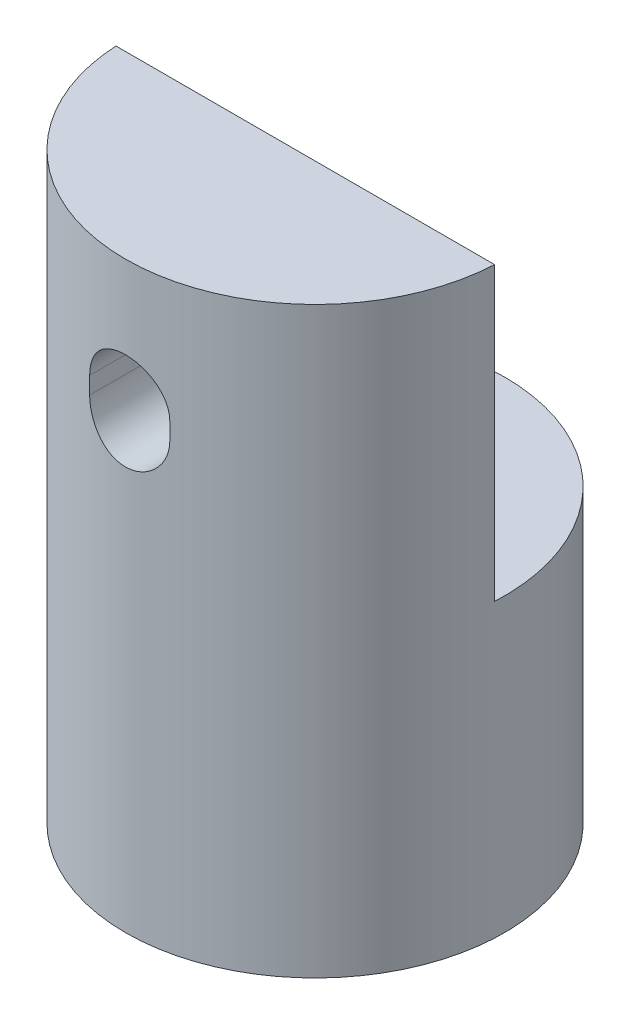
ISO-10303-21;
HEADER;
FILE_DESCRIPTION(('STEP AP214'),'2;1');
FILE_NAME('part.step','',(''),(''),'','','');
FILE_SCHEMA(('AUTOMOTIVE_DESIGN { 1 0 10303 214 1 1 1 1 }'));
ENDSEC;
DATA;
#1=APPLICATION_CONTEXT('core data for automotive mechanical design processes');
#2=APPLICATION_PROTOCOL_DEFINITION('international standard','automotive_design',2000,#1);
#3=PRODUCT_CONTEXT('',#1,'mechanical');
#4=PRODUCT('Part','Part','',(#3));
#5=PRODUCT_RELATED_PRODUCT_CATEGORY('part','',(#4));
#6=PRODUCT_DEFINITION_FORMATION('','',#4);
#7=PRODUCT_DEFINITION_CONTEXT('part definition',#1,'design');
#8=PRODUCT_DEFINITION('design','',#6,#7);
#9=PRODUCT_DEFINITION_SHAPE('','',#8);
#10=(LENGTH_UNIT() NAMED_UNIT(*) SI_UNIT(.MILLI.,.METRE.));
#11=(NAMED_UNIT(*) PLANE_ANGLE_UNIT() SI_UNIT($,.RADIAN.));
#12=(NAMED_UNIT(*) SI_UNIT($,.STERADIAN.) SOLID_ANGLE_UNIT());
#13=UNCERTAINTY_MEASURE_WITH_UNIT(LENGTH_MEASURE(1.E-05),#10,'distance_accuracy_value','');
#14=(GEOMETRIC_REPRESENTATION_CONTEXT(3) GLOBAL_UNCERTAINTY_ASSIGNED_CONTEXT((#13)) GLOBAL_UNIT_ASSIGNED_CONTEXT((#10,
#11,#12)) REPRESENTATION_CONTEXT('',''));
#15=CARTESIAN_POINT('',(0.,0.,0.));
#16=DIRECTION('',(0.,0.,1.));
#17=DIRECTION('',(1.,0.,0.));
#18=AXIS2_PLACEMENT_3D('',#15,#16,#17);
#19=CARTESIAN_POINT('',(0.,30.,0.));
#20=DIRECTION('',(0.,-1.,0.));
#21=DIRECTION('',(0.,0.,-1.));
#22=AXIS2_PLACEMENT_3D('',#19,#20,#21);
#23=CYLINDRICAL_SURFACE('',#22,9.75);
#24=DIRECTION('',(0.,-1.,0.));
#25=VECTOR('',#24,1.);
#26=CARTESIAN_POINT('',(-2.06,30.,9.52989506762797));
#27=LINE('',#26,#25);
#28=CARTESIAN_POINT('',(-2.06,22.8038436319264,9.52989506762798));
#29=VERTEX_POINT('',#28);
#30=CARTESIAN_POINT('',(-2.06,23.6838436319264,9.52989506762798));
#31=VERTEX_POINT('',#30);
#32=EDGE_CURVE('E137',#29,#31,#27,.F.);
#33=ORIENTED_EDGE('',*,*,#32,.T.);
#34=CARTESIAN_POINT('',(-2.06,23.6838436319264,9.52989506762798));
#35=CARTESIAN_POINT('',(-2.06000038621837,23.7411085082701,9.52989193022189));
#36=CARTESIAN_POINT('',(-2.05761066949661,23.7983452952369,9.53041187918061));
#37=CARTESIAN_POINT('',(-2.04808217298445,23.912396312023,9.5324652984884));
#38=CARTESIAN_POINT('',(-2.04094402376096,23.9692105969356,9.53399863426485));
#39=CARTESIAN_POINT('',(-2.01250017775518,24.1382108822364,9.54005984803306));
#40=CARTESIAN_POINT('',(-1.9841647172553,24.2492443030661,9.546049254901));
#41=CARTESIAN_POINT('',(-1.90962694204132,24.464840568082,9.56123696034495));
#42=CARTESIAN_POINT('',(-1.86342340173066,24.5694029678409,9.57043547903419));
#43=CARTESIAN_POINT('',(-1.7545022172229,24.7693282362813,9.59100011991839));
#44=CARTESIAN_POINT('',(-1.69178229715054,24.8646898346615,9.60236654077997));
#45=CARTESIAN_POINT('',(-1.55056862612832,25.0449579130215,9.62618413463338));
#46=CARTESIAN_POINT('',(-1.47186594523217,25.1296989657252,9.63864828762398));
#47=CARTESIAN_POINT('',(-1.30136353725704,25.2848880729349,9.66314432948129));
#48=CARTESIAN_POINT('',(-1.20956177402956,25.3553339012304,9.6751761507808));
#49=CARTESIAN_POINT('',(-1.01436038066463,25.4805764627145,9.69759264624504));
#50=CARTESIAN_POINT('',(-0.910856271716384,25.5352137008478,9.70796009267165));
#51=CARTESIAN_POINT('',(-0.695886068923282,25.6262551924741,9.72573176091931));
#52=CARTESIAN_POINT('',(-0.584421235540617,25.6626623251519,9.73313645062834));
#53=CARTESIAN_POINT('',(-0.358420488315619,25.7156922666601,9.74405668426251));
#54=CARTESIAN_POINT('',(-0.243953428048264,25.732596922973,9.74762757982839));
#55=CARTESIAN_POINT('',(-0.0137533854890558,25.7470226358862,9.75066945348648));
#56=CARTESIAN_POINT('',(0.101979489574583,25.7445453218425,9.75014077621158));
#57=CARTESIAN_POINT('',(0.329479869632201,25.7204881667035,9.74508545653354));
#58=CARTESIAN_POINT('',(0.441281163046918,25.6992125121008,9.74062247985344));
#59=CARTESIAN_POINT('',(0.659689077092426,25.6386466032549,9.72827231497749));
#60=CARTESIAN_POINT('',(0.766295513092981,25.5993557092485,9.72038500517614));
#61=CARTESIAN_POINT('',(0.972143956256036,25.5035997976003,9.70196883967549));
#62=CARTESIAN_POINT('',(1.07132980214858,25.4470176389109,9.69142205512789));
#63=CARTESIAN_POINT('',(1.25890736968498,25.3183739563362,9.66884640198345));
#64=CARTESIAN_POINT('',(1.34729803935739,25.2463109257512,9.6568173891751));
#65=CARTESIAN_POINT('',(1.51257710042549,25.0871003621357,9.63232767255897));
#66=CARTESIAN_POINT('',(1.58921030181268,24.9996883171354,9.61986311839955));
#67=CARTESIAN_POINT('',(1.72679490128979,24.8130980227979,9.59612266174681));
#68=CARTESIAN_POINT('',(1.78774198550031,24.713916547653,9.58484708673988));
#69=CARTESIAN_POINT('',(1.8923297342785,24.5061940802471,9.56475009541621));
#70=CARTESIAN_POINT('',(1.93591508485627,24.3976244938528,9.55593654927679));
#71=CARTESIAN_POINT('',(2.0040888142044,24.1745416553473,9.54187403755511));
#72=CARTESIAN_POINT('',(2.02870548206141,24.0600375270301,9.53661976524368));
#73=CARTESIAN_POINT('',(2.0489732572593,23.9011417387049,9.53227293939137));
#74=CARTESIAN_POINT('',(2.05310958508113,23.85775231278,9.53138229419952));
#75=CARTESIAN_POINT('',(2.05861955750802,23.7708630637744,9.53019380798568));
#76=CARTESIAN_POINT('',(2.0599978060911,23.7273635462361,9.52989497907139));
#77=CARTESIAN_POINT('',(2.06,23.6838436319264,9.52989506762797));
#78=B_SPLINE_CURVE_WITH_KNOTS('',3,(#34,#35,#36,#37,#38,#39,#40,#41,#42,#43,#44,#45,#46,#47,#48,
#49,#50,#51,#52,#53,#54,#55,#56,#57,#58,#59,#60,#61,#62,#63,#64,#65,#66,#67,#68,#69,#70,#71,#72,
#73,#74,#75,#76,#77),.UNSPECIFIED.,.F.,.F.,(4,2,2,2,2,2,2,2,2,2,2,2,2,2,2,2,2,2,2,2,2,4),(0.,
0.171687012549871,0.343351230515572,0.685820970526505,1.02831420518304,1.37085465842713,
1.71820019515376,2.06559978292764,2.41639099845765,2.76712679403448,3.11272766564466,
3.45829948443912,3.79837977364326,4.13847214082595,4.48092157945591,4.82340436261574,
5.17250329507619,5.52169813179115,5.87199676191639,6.22177195500534,6.35248659373434,
6.48298285186032),.UNSPECIFIED.);
#79=CARTESIAN_POINT('',(2.06,23.6838436319264,9.52989506762798));
#80=VERTEX_POINT('',#79);
#81=EDGE_CURVE('E151',#31,#80,#78,.T.);
#82=ORIENTED_EDGE('',*,*,#81,.T.);
#83=DIRECTION('',(0.,-1.,0.));
#84=VECTOR('',#83,1.);
#85=CARTESIAN_POINT('',(2.06,30.,9.52989506762797));
#86=LINE('',#85,#84);
#87=CARTESIAN_POINT('',(2.06,22.8038436319264,9.52989506762797));
#88=VERTEX_POINT('',#87);
#89=EDGE_CURVE('E123',#80,#88,#86,.T.);
#90=ORIENTED_EDGE('',*,*,#89,.T.);
#91=CARTESIAN_POINT('',(2.06,22.8038436319264,9.52989506762797));
#92=CARTESIAN_POINT('',(2.06000038621837,22.7465787555826,9.52989193022189));
#93=CARTESIAN_POINT('',(2.05761066949661,22.6893419686158,9.53041187918061));
#94=CARTESIAN_POINT('',(2.04808217298445,22.5752909518297,9.5324652984884));
#95=CARTESIAN_POINT('',(2.04094402376096,22.5184766669172,9.53399863426485));
#96=CARTESIAN_POINT('',(2.01250017775518,22.3494763816164,9.54005984803305));
#97=CARTESIAN_POINT('',(1.9841647172553,22.2384429607866,9.546049254901));
#98=CARTESIAN_POINT('',(1.90962694204132,22.0228466957708,9.56123696034495));
#99=CARTESIAN_POINT('',(1.86342340173066,21.9182842960118,9.57043547903419));
#100=CARTESIAN_POINT('',(1.7545022172229,21.7183590275715,9.59100011991839));
#101=CARTESIAN_POINT('',(1.69178229715054,21.6229974291912,9.60236654077997));
#102=CARTESIAN_POINT('',(1.55056862612832,21.4427293508313,9.62618413463338));
#103=CARTESIAN_POINT('',(1.47186594523217,21.3579882981276,9.63864828762398));
#104=CARTESIAN_POINT('',(1.30136353725705,21.2027991909178,9.66314432948129));
#105=CARTESIAN_POINT('',(1.20956177402957,21.1323533626223,9.6751761507808));
#106=CARTESIAN_POINT('',(1.01436038066463,21.0071108011383,9.69759264624504));
#107=CARTESIAN_POINT('',(0.910856271716385,20.952473563005,9.70796009267165));
#108=CARTESIAN_POINT('',(0.695886068923283,20.8614320713787,9.72573176091931));
#109=CARTESIAN_POINT('',(0.584421235540617,20.8250249387008,9.73313645062834));
#110=CARTESIAN_POINT('',(0.35842048831562,20.7719949971927,9.74405668426251));
#111=CARTESIAN_POINT('',(0.243953428048265,20.7550903408797,9.74762757982839));
#112=CARTESIAN_POINT('',(0.0137533854890566,20.7406646279665,9.75066945348649));
#113=CARTESIAN_POINT('',(-0.101979489574583,20.7431419420103,9.75014077621158));
#114=CARTESIAN_POINT('',(-0.329479869632201,20.7671990971492,9.74508545653354));
#115=CARTESIAN_POINT('',(-0.441281163046918,20.7884747517519,9.74062247985344));
#116=CARTESIAN_POINT('',(-0.659689077092425,20.8490406605979,9.72827231497749));
#117=CARTESIAN_POINT('',(-0.76629551309298,20.8883315546042,9.72038500517614));
#118=CARTESIAN_POINT('',(-0.972143956256037,20.9840874662524,9.70196883967549));
#119=CARTESIAN_POINT('',(-1.07132980214858,21.0406696249418,9.69142205512789));
#120=CARTESIAN_POINT('',(-1.25890736968498,21.1693133075166,9.66884640198345));
#121=CARTESIAN_POINT('',(-1.34729803935739,21.2413763381016,9.6568173891751));
#122=CARTESIAN_POINT('',(-1.51257710042549,21.4005869017171,9.63232767255897));
#123=CARTESIAN_POINT('',(-1.58921030181268,21.4879989467174,9.61986311839955));
#124=CARTESIAN_POINT('',(-1.72679490128979,21.6745892410549,9.59612266174681));
#125=CARTESIAN_POINT('',(-1.78774198550031,21.7737707161998,9.58484708673988));
#126=CARTESIAN_POINT('',(-1.8923297342785,21.9814931836056,9.56475009541621));
#127=CARTESIAN_POINT('',(-1.93591508485627,22.09006277,9.55593654927679));
#128=CARTESIAN_POINT('',(-2.00408881420439,22.3131456085055,9.54187403755511));
#129=CARTESIAN_POINT('',(-2.02870548206141,22.4276497368227,9.53661976524368));
#130=CARTESIAN_POINT('',(-2.0489732572593,22.5865455251478,9.53227293939137));
#131=CARTESIAN_POINT('',(-2.05310958508113,22.6299349510728,9.53138229419952));
#132=CARTESIAN_POINT('',(-2.05861955750802,22.7168242000783,9.53019380798569));
#133=CARTESIAN_POINT('',(-2.0599978060911,22.7603237176167,9.52989497907139));
#134=CARTESIAN_POINT('',(-2.06,22.8038436319264,9.52989506762797));
#135=B_SPLINE_CURVE_WITH_KNOTS('',3,(#91,#92,#93,#94,#95,#96,#97,#98,#99,#100,#101,#102,#103,
#104,#105,#106,#107,#108,#109,#110,#111,#112,#113,#114,#115,#116,#117,#118,#119,#120,#121,#122,
#123,#124,#125,#126,#127,#128,#129,#130,#131,#132,#133,#134),.UNSPECIFIED.,.F.,.F.,(4,2,2,2,2,2,
2,2,2,2,2,2,2,2,2,2,2,2,2,2,2,4),(0.,0.171687012549871,0.343351230515572,0.685820970526505,
1.02831420518304,1.37085465842713,1.71820019515376,2.06559978292764,2.41639099845765,
2.76712679403448,3.11272766564466,3.45829948443912,3.79837977364326,4.13847214082596,
4.48092157945592,4.82340436261574,5.17250329507619,5.52169813179115,5.87199676191639,
6.22177195500534,6.35248659373434,6.48298285186032),.UNSPECIFIED.);
#136=EDGE_CURVE('E98',#88,#29,#135,.T.);
#137=ORIENTED_EDGE('',*,*,#136,.T.);
#138=EDGE_LOOP('',(#33,#82,#90,#137));
#139=FACE_BOUND('',#138,.T.);
#140=CARTESIAN_POINT('',(0.,0.,0.));
#141=DIRECTION('',(0.,1.,0.));
#142=DIRECTION('',(0.,0.,1.));
#143=AXIS2_PLACEMENT_3D('',#140,#141,#142);
#144=CIRCLE('',#143,9.75);
#145=CARTESIAN_POINT('',(0.,0.,9.75));
#146=VERTEX_POINT('',#145);
#147=EDGE_CURVE('E171',#146,#146,#144,.T.);
#148=ORIENTED_EDGE('',*,*,#147,.T.);
#149=EDGE_LOOP('',(#148));
#150=FACE_BOUND('',#149,.T.);
#151=DIRECTION('',(0.,-1.,0.));
#152=VECTOR('',#151,1.);
#153=CARTESIAN_POINT('',(-9.73717104707522,30.,0.5));
#154=LINE('',#153,#152);
#155=CARTESIAN_POINT('',(-9.73717104707522,30.,0.5));
#156=VERTEX_POINT('',#155);
#157=CARTESIAN_POINT('',(-9.73717104707522,15.,0.5));
#158=VERTEX_POINT('',#157);
#159=EDGE_CURVE('E167',#156,#158,#154,.T.);
#160=ORIENTED_EDGE('',*,*,#159,.T.);
#161=CARTESIAN_POINT('',(0.,15.,0.));
#162=DIRECTION('',(0.,1.,0.));
#163=DIRECTION('',(-1.,0.,0.));
#164=AXIS2_PLACEMENT_3D('',#161,#162,#163);
#165=CIRCLE('',#164,9.75);
#166=CARTESIAN_POINT('',(9.73717104707522,15.,0.5));
#167=VERTEX_POINT('',#166);
#168=EDGE_CURVE('E11',#167,#158,#165,.T.);
#169=ORIENTED_EDGE('',*,*,#168,.F.);
#170=DIRECTION('',(0.,-1.,0.));
#171=VECTOR('',#170,1.);
#172=CARTESIAN_POINT('',(9.73717104707522,30.,0.5));
#173=LINE('',#172,#171);
#174=CARTESIAN_POINT('',(9.73717104707522,30.,0.5));
#175=VERTEX_POINT('',#174);
#176=EDGE_CURVE('E163',#167,#175,#173,.F.);
#177=ORIENTED_EDGE('',*,*,#176,.T.);
#178=CARTESIAN_POINT('',(0.,30.,0.));
#179=DIRECTION('',(0.,1.,0.));
#180=DIRECTION('',(0.,0.,1.));
#181=AXIS2_PLACEMENT_3D('',#178,#179,#180);
#182=CIRCLE('',#181,9.75);
#183=EDGE_CURVE('E172',#156,#175,#182,.T.);
#184=ORIENTED_EDGE('',*,*,#183,.F.);
#185=EDGE_LOOP('',(#160,#169,#177,#184));
#186=FACE_BOUND('',#185,.T.);
#187=ADVANCED_FACE('F39',(#139,#150,#186),#23,.T.);
#188=CARTESIAN_POINT('',(0.,30.,0.));
#189=DIRECTION('',(0.,1.,0.));
#190=DIRECTION('',(0.,0.,1.));
#191=AXIS2_PLACEMENT_3D('',#188,#189,#190);
#192=PLANE('',#191);
#193=DIRECTION('',(1.,0.,0.));
#194=VECTOR('',#193,1.);
#195=CARTESIAN_POINT('',(0.,30.,0.5));
#196=LINE('',#195,#194);
#197=EDGE_CURVE('E48',#156,#175,#196,.T.);
#198=ORIENTED_EDGE('',*,*,#197,.F.);
#199=ORIENTED_EDGE('',*,*,#183,.T.);
#200=EDGE_LOOP('',(#198,#199));
#201=FACE_BOUND('',#200,.T.);
#202=ADVANCED_FACE('F185',(#201),#192,.T.);
#203=CARTESIAN_POINT('',(0.,0.,0.));
#204=DIRECTION('',(0.,1.,0.));
#205=DIRECTION('',(0.,0.,1.));
#206=AXIS2_PLACEMENT_3D('',#203,#204,#205);
#207=PLANE('',#206);
#208=ORIENTED_EDGE('',*,*,#147,.F.);
#209=EDGE_LOOP('',(#208));
#210=FACE_BOUND('',#209,.T.);
#211=ADVANCED_FACE('F187',(#210),#207,.F.);
#212=CARTESIAN_POINT('',(-9.75,15.,0.5));
#213=DIRECTION('',(0.,1.,0.));
#214=DIRECTION('',(-1.,0.,0.));
#215=AXIS2_PLACEMENT_3D('',#212,#213,#214);
#216=PLANE('',#215);
#217=ORIENTED_EDGE('',*,*,#168,.T.);
#218=DIRECTION('',(1.,0.,0.));
#219=VECTOR('',#218,1.);
#220=CARTESIAN_POINT('',(-9.75,15.,0.5));
#221=LINE('',#220,#219);
#222=EDGE_CURVE('E159',#158,#167,#221,.T.);
#223=ORIENTED_EDGE('',*,*,#222,.T.);
#224=EDGE_LOOP('',(#217,#223));
#225=FACE_BOUND('',#224,.T.);
#226=ADVANCED_FACE('F193',(#225),#216,.T.);
#227=CARTESIAN_POINT('',(0.,0.,0.5));
#228=DIRECTION('',(0.,0.,1.));
#229=DIRECTION('',(1.,0.,0.));
#230=AXIS2_PLACEMENT_3D('',#227,#228,#229);
#231=PLANE('',#230);
#232=DIRECTION('',(0.,-1.,0.));
#233=VECTOR('',#232,1.);
#234=CARTESIAN_POINT('',(2.06,23.6838436319264,0.5));
#235=LINE('',#234,#233);
#236=CARTESIAN_POINT('',(2.06,23.6838436319264,0.5));
#237=VERTEX_POINT('',#236);
#238=CARTESIAN_POINT('',(2.06,22.8038436319264,0.5));
#239=VERTEX_POINT('',#238);
#240=EDGE_CURVE('E105',#237,#239,#235,.T.);
#241=ORIENTED_EDGE('',*,*,#240,.F.);
#242=CARTESIAN_POINT('',(0.,23.6838436319264,0.5));
#243=DIRECTION('',(0.,0.,-1.));
#244=DIRECTION('',(-1.,0.,0.));
#245=AXIS2_PLACEMENT_3D('',#242,#243,#244);
#246=CIRCLE('',#245,2.06);
#247=CARTESIAN_POINT('',(-2.06,23.6838436319264,0.5));
#248=VERTEX_POINT('',#247);
#249=EDGE_CURVE('E63',#248,#237,#246,.T.);
#250=ORIENTED_EDGE('',*,*,#249,.F.);
#251=DIRECTION('',(0.,1.,0.));
#252=VECTOR('',#251,1.);
#253=CARTESIAN_POINT('',(-2.06,23.6838436319264,0.5));
#254=LINE('',#253,#252);
#255=CARTESIAN_POINT('',(-2.06,22.8038436319264,0.5));
#256=VERTEX_POINT('',#255);
#257=EDGE_CURVE('E113',#256,#248,#254,.T.);
#258=ORIENTED_EDGE('',*,*,#257,.F.);
#259=CARTESIAN_POINT('',(0.,22.8038436319264,0.5));
#260=DIRECTION('',(0.,0.,-1.));
#261=DIRECTION('',(-1.,0.,0.));
#262=AXIS2_PLACEMENT_3D('',#259,#260,#261);
#263=CIRCLE('',#262,2.06);
#264=EDGE_CURVE('E95',#239,#256,#263,.T.);
#265=ORIENTED_EDGE('',*,*,#264,.F.);
#266=EDGE_LOOP('',(#241,#250,#258,#265));
#267=FACE_BOUND('',#266,.T.);
#268=ORIENTED_EDGE('',*,*,#197,.T.);
#269=ORIENTED_EDGE('',*,*,#176,.F.);
#270=ORIENTED_EDGE('',*,*,#222,.F.);
#271=ORIENTED_EDGE('',*,*,#159,.F.);
#272=EDGE_LOOP('',(#268,#269,#270,#271));
#273=FACE_BOUND('',#272,.T.);
#274=ADVANCED_FACE('F110',(#267,#273),#231,.F.);
#275=CARTESIAN_POINT('',(0.,23.6838436319264,30.5));
#276=DIRECTION('',(0.,0.,-1.));
#277=DIRECTION('',(-1.,0.,0.));
#278=AXIS2_PLACEMENT_3D('',#275,#276,#277);
#279=CYLINDRICAL_SURFACE('',#278,2.06);
#280=DIRECTION('',(0.,0.,-1.));
#281=VECTOR('',#280,1.);
#282=CARTESIAN_POINT('',(-2.06,23.6838436319264,30.5));
#283=LINE('',#282,#281);
#284=EDGE_CURVE('E120',#31,#248,#283,.T.);
#285=ORIENTED_EDGE('',*,*,#284,.T.);
#286=ORIENTED_EDGE('',*,*,#249,.T.);
#287=DIRECTION('',(0.,0.,-1.));
#288=VECTOR('',#287,1.);
#289=CARTESIAN_POINT('',(2.06,23.6838436319264,30.5));
#290=LINE('',#289,#288);
#291=EDGE_CURVE('E102',#80,#237,#290,.T.);
#292=ORIENTED_EDGE('',*,*,#291,.F.);
#293=ORIENTED_EDGE('',*,*,#81,.F.);
#294=EDGE_LOOP('',(#285,#286,#292,#293));
#295=FACE_BOUND('',#294,.T.);
#296=ADVANCED_FACE('F146',(#295),#279,.F.);
#297=CARTESIAN_POINT('',(-2.06,23.6838436319264,30.5));
#298=DIRECTION('',(-1.,0.,0.));
#299=DIRECTION('',(0.,0.,1.));
#300=AXIS2_PLACEMENT_3D('',#297,#298,#299);
#301=PLANE('',#300);
#302=DIRECTION('',(0.,0.,-1.));
#303=VECTOR('',#302,1.);
#304=CARTESIAN_POINT('',(-2.06,22.8038436319264,30.5));
#305=LINE('',#304,#303);
#306=EDGE_CURVE('E101',#29,#256,#305,.T.);
#307=ORIENTED_EDGE('',*,*,#306,.T.);
#308=ORIENTED_EDGE('',*,*,#257,.T.);
#309=ORIENTED_EDGE('',*,*,#284,.F.);
#310=ORIENTED_EDGE('',*,*,#32,.F.);
#311=EDGE_LOOP('',(#307,#308,#309,#310));
#312=FACE_BOUND('',#311,.T.);
#313=ADVANCED_FACE('F143',(#312),#301,.F.);
#314=CARTESIAN_POINT('',(0.,22.8038436319264,30.5));
#315=DIRECTION('',(0.,0.,-1.));
#316=DIRECTION('',(-1.,0.,0.));
#317=AXIS2_PLACEMENT_3D('',#314,#315,#316);
#318=CYLINDRICAL_SURFACE('',#317,2.06);
#319=DIRECTION('',(0.,0.,-1.));
#320=VECTOR('',#319,1.);
#321=CARTESIAN_POINT('',(2.06,22.8038436319264,30.5));
#322=LINE('',#321,#320);
#323=EDGE_CURVE('E55',#88,#239,#322,.T.);
#324=ORIENTED_EDGE('',*,*,#323,.T.);
#325=ORIENTED_EDGE('',*,*,#264,.T.);
#326=ORIENTED_EDGE('',*,*,#306,.F.);
#327=ORIENTED_EDGE('',*,*,#136,.F.);
#328=EDGE_LOOP('',(#324,#325,#326,#327));
#329=FACE_BOUND('',#328,.T.);
#330=ADVANCED_FACE('F92',(#329),#318,.F.);
#331=CARTESIAN_POINT('',(2.06,23.6838436319264,30.5));
#332=DIRECTION('',(1.,0.,0.));
#333=DIRECTION('',(0.,0.,-1.));
#334=AXIS2_PLACEMENT_3D('',#331,#332,#333);
#335=PLANE('',#334);
#336=ORIENTED_EDGE('',*,*,#291,.T.);
#337=ORIENTED_EDGE('',*,*,#240,.T.);
#338=ORIENTED_EDGE('',*,*,#323,.F.);
#339=ORIENTED_EDGE('',*,*,#89,.F.);
#340=EDGE_LOOP('',(#336,#337,#338,#339));
#341=FACE_BOUND('',#340,.T.);
#342=ADVANCED_FACE('F106',(#341),#335,.F.);
#343=CLOSED_SHELL('',(#187,#202,#211,#226,#274,#296,#313,#330,#342));
#344=MANIFOLD_SOLID_BREP('B2',#343);
#345=ADVANCED_BREP_SHAPE_REPRESENTATION('',(#18,#344),#14);
#346=SHAPE_DEFINITION_REPRESENTATION(#9,#345);
ENDSEC;
END-ISO-10303-21;
